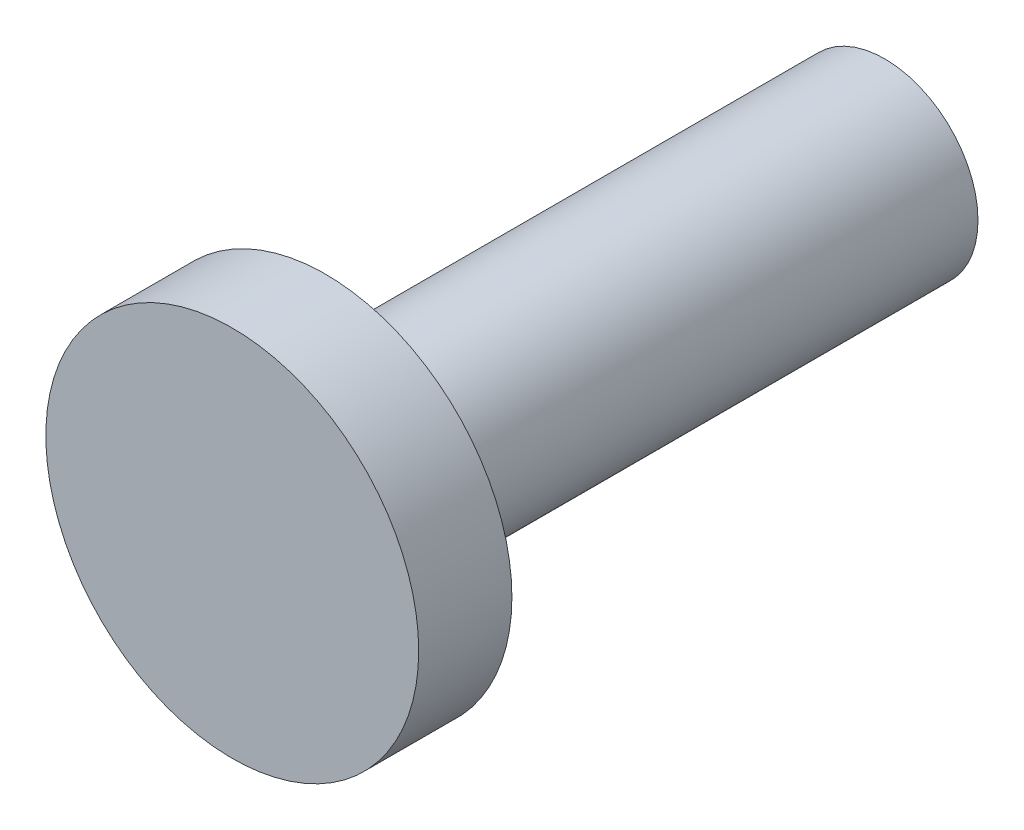
ISO-10303-21;
HEADER;
FILE_DESCRIPTION(('STEP AP214'),'2;1');
FILE_NAME('part.step','',(''),(''),'','','');
FILE_SCHEMA(('AUTOMOTIVE_DESIGN { 1 0 10303 214 1 1 1 1 }'));
ENDSEC;
DATA;
#1=APPLICATION_CONTEXT('core data for automotive mechanical design processes');
#2=APPLICATION_PROTOCOL_DEFINITION('international standard','automotive_design',2000,#1);
#3=PRODUCT_CONTEXT('',#1,'mechanical');
#4=PRODUCT('Part','Part','',(#3));
#5=PRODUCT_RELATED_PRODUCT_CATEGORY('part','',(#4));
#6=PRODUCT_DEFINITION_FORMATION('','',#4);
#7=PRODUCT_DEFINITION_CONTEXT('part definition',#1,'design');
#8=PRODUCT_DEFINITION('design','',#6,#7);
#9=PRODUCT_DEFINITION_SHAPE('','',#8);
#10=(LENGTH_UNIT() NAMED_UNIT(*) SI_UNIT(.MILLI.,.METRE.));
#11=(NAMED_UNIT(*) PLANE_ANGLE_UNIT() SI_UNIT($,.RADIAN.));
#12=(NAMED_UNIT(*) SI_UNIT($,.STERADIAN.) SOLID_ANGLE_UNIT());
#13=UNCERTAINTY_MEASURE_WITH_UNIT(LENGTH_MEASURE(1.E-05),#10,'distance_accuracy_value','');
#14=(GEOMETRIC_REPRESENTATION_CONTEXT(3) GLOBAL_UNCERTAINTY_ASSIGNED_CONTEXT((#13)) GLOBAL_UNIT_ASSIGNED_CONTEXT((#10,
#11,#12)) REPRESENTATION_CONTEXT('',''));
#15=CARTESIAN_POINT('',(0.,0.,0.));
#16=DIRECTION('',(0.,0.,1.));
#17=DIRECTION('',(1.,0.,0.));
#18=AXIS2_PLACEMENT_3D('',#15,#16,#17);
#19=CARTESIAN_POINT('',(0.,0.,60.));
#20=DIRECTION('',(0.,0.,-1.));
#21=DIRECTION('',(-1.,0.,0.));
#22=AXIS2_PLACEMENT_3D('',#19,#20,#21);
#23=CYLINDRICAL_SURFACE('',#22,10.);
#24=CARTESIAN_POINT('',(0.,0.,60.));
#25=DIRECTION('',(0.,0.,1.));
#26=DIRECTION('',(1.,0.,0.));
#27=AXIS2_PLACEMENT_3D('',#24,#25,#26);
#28=CIRCLE('',#27,10.);
#29=CARTESIAN_POINT('',(10.,0.,60.));
#30=VERTEX_POINT('',#29);
#31=EDGE_CURVE('E10',#30,#30,#28,.T.);
#32=ORIENTED_EDGE('',*,*,#31,.F.);
#33=EDGE_LOOP('',(#32));
#34=FACE_BOUND('',#33,.T.);
#35=CARTESIAN_POINT('',(0.,0.,0.));
#36=DIRECTION('',(0.,0.,1.));
#37=DIRECTION('',(1.,0.,0.));
#38=AXIS2_PLACEMENT_3D('',#35,#36,#37);
#39=CIRCLE('',#38,10.);
#40=CARTESIAN_POINT('',(10.,0.,0.));
#41=VERTEX_POINT('',#40);
#42=EDGE_CURVE('E40',#41,#41,#39,.T.);
#43=ORIENTED_EDGE('',*,*,#42,.T.);
#44=EDGE_LOOP('',(#43));
#45=FACE_BOUND('',#44,.T.);
#46=ADVANCED_FACE('F37',(#34,#45),#23,.T.);
#47=CARTESIAN_POINT('',(0.,0.,0.));
#48=DIRECTION('',(0.,0.,1.));
#49=DIRECTION('',(1.,0.,0.));
#50=AXIS2_PLACEMENT_3D('',#47,#48,#49);
#51=PLANE('',#50);
#52=ORIENTED_EDGE('',*,*,#42,.F.);
#53=EDGE_LOOP('',(#52));
#54=FACE_BOUND('',#53,.T.);
#55=ADVANCED_FACE('F64',(#54),#51,.F.);
#56=CARTESIAN_POINT('',(0.,0.,70.));
#57=DIRECTION('',(0.,0.,-1.));
#58=DIRECTION('',(-1.,0.,0.));
#59=AXIS2_PLACEMENT_3D('',#56,#57,#58);
#60=CYLINDRICAL_SURFACE('',#59,20.);
#61=CARTESIAN_POINT('',(0.,0.,70.));
#62=DIRECTION('',(0.,0.,1.));
#63=DIRECTION('',(1.,0.,0.));
#64=AXIS2_PLACEMENT_3D('',#61,#62,#63);
#65=CIRCLE('',#64,20.);
#66=CARTESIAN_POINT('',(20.,0.,70.));
#67=VERTEX_POINT('',#66);
#68=EDGE_CURVE('E49',#67,#67,#65,.T.);
#69=ORIENTED_EDGE('',*,*,#68,.F.);
#70=EDGE_LOOP('',(#69));
#71=FACE_BOUND('',#70,.T.);
#72=CARTESIAN_POINT('',(0.,0.,60.));
#73=DIRECTION('',(0.,0.,1.));
#74=DIRECTION('',(1.,0.,0.));
#75=AXIS2_PLACEMENT_3D('',#72,#73,#74);
#76=CIRCLE('',#75,20.);
#77=CARTESIAN_POINT('',(20.,0.,60.));
#78=VERTEX_POINT('',#77);
#79=EDGE_CURVE('E51',#78,#78,#76,.T.);
#80=ORIENTED_EDGE('',*,*,#79,.T.);
#81=EDGE_LOOP('',(#80));
#82=FACE_BOUND('',#81,.T.);
#83=ADVANCED_FACE('F61',(#71,#82),#60,.T.);
#84=CARTESIAN_POINT('',(0.,0.,70.));
#85=DIRECTION('',(0.,0.,1.));
#86=DIRECTION('',(1.,0.,0.));
#87=AXIS2_PLACEMENT_3D('',#84,#85,#86);
#88=PLANE('',#87);
#89=ORIENTED_EDGE('',*,*,#68,.T.);
#90=EDGE_LOOP('',(#89));
#91=FACE_BOUND('',#90,.T.);
#92=ADVANCED_FACE('F59',(#91),#88,.T.);
#93=CARTESIAN_POINT('',(0.,0.,60.));
#94=DIRECTION('',(0.,0.,1.));
#95=DIRECTION('',(1.,0.,0.));
#96=AXIS2_PLACEMENT_3D('',#93,#94,#95);
#97=PLANE('',#96);
#98=ORIENTED_EDGE('',*,*,#31,.T.);
#99=EDGE_LOOP('',(#98));
#100=FACE_BOUND('',#99,.T.);
#101=ORIENTED_EDGE('',*,*,#79,.F.);
#102=EDGE_LOOP('',(#101));
#103=FACE_BOUND('',#102,.T.);
#104=ADVANCED_FACE('F68',(#100,#103),#97,.F.);
#105=CLOSED_SHELL('',(#46,#55,#83,#92,#104));
#106=MANIFOLD_SOLID_BREP('B2',#105);
#107=ADVANCED_BREP_SHAPE_REPRESENTATION('',(#18,#106),#14);
#108=SHAPE_DEFINITION_REPRESENTATION(#9,#107);
ENDSEC;
END-ISO-10303-21;
